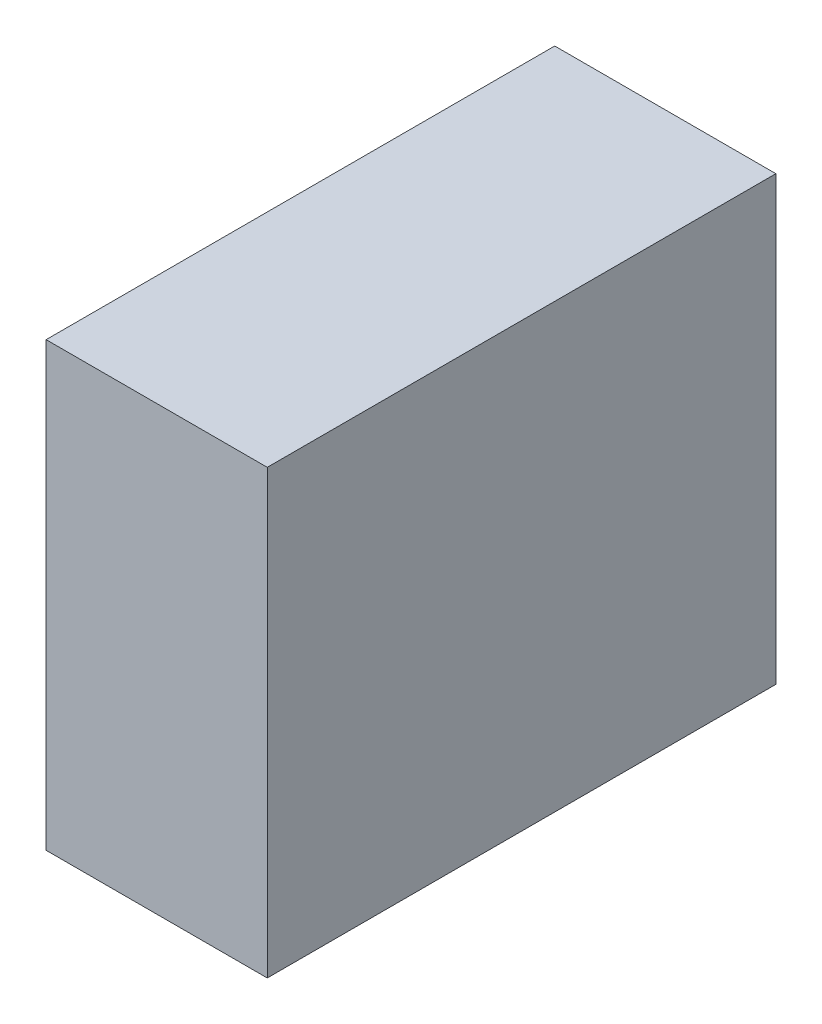
ISO-10303-21;
HEADER;
FILE_DESCRIPTION(('STEP AP214'),'2;1');
FILE_NAME('part.step','',(''),(''),'','','');
FILE_SCHEMA(('AUTOMOTIVE_DESIGN { 1 0 10303 214 1 1 1 1 }'));
ENDSEC;
DATA;
#1=APPLICATION_CONTEXT('core data for automotive mechanical design processes');
#2=APPLICATION_PROTOCOL_DEFINITION('international standard','automotive_design',2000,#1);
#3=PRODUCT_CONTEXT('',#1,'mechanical');
#4=PRODUCT('Part','Part','',(#3));
#5=PRODUCT_RELATED_PRODUCT_CATEGORY('part','',(#4));
#6=PRODUCT_DEFINITION_FORMATION('','',#4);
#7=PRODUCT_DEFINITION_CONTEXT('part definition',#1,'design');
#8=PRODUCT_DEFINITION('design','',#6,#7);
#9=PRODUCT_DEFINITION_SHAPE('','',#8);
#10=(LENGTH_UNIT() NAMED_UNIT(*) SI_UNIT(.MILLI.,.METRE.));
#11=(NAMED_UNIT(*) PLANE_ANGLE_UNIT() SI_UNIT($,.RADIAN.));
#12=(NAMED_UNIT(*) SI_UNIT($,.STERADIAN.) SOLID_ANGLE_UNIT());
#13=UNCERTAINTY_MEASURE_WITH_UNIT(LENGTH_MEASURE(1.E-05),#10,'distance_accuracy_value','');
#14=(GEOMETRIC_REPRESENTATION_CONTEXT(3) GLOBAL_UNCERTAINTY_ASSIGNED_CONTEXT((#13)) GLOBAL_UNIT_ASSIGNED_CONTEXT((#10,
#11,#12)) REPRESENTATION_CONTEXT('',''));
#15=CARTESIAN_POINT('',(0.,0.,0.));
#16=DIRECTION('',(0.,0.,1.));
#17=DIRECTION('',(1.,0.,0.));
#18=AXIS2_PLACEMENT_3D('',#15,#16,#17);
#19=CARTESIAN_POINT('',(10.,0.,0.));
#20=DIRECTION('',(0.,0.,-1.));
#21=DIRECTION('',(-1.,0.,0.));
#22=AXIS2_PLACEMENT_3D('',#19,#20,#21);
#23=PLANE('',#22);
#24=DIRECTION('',(0.,-1.,0.));
#25=VECTOR('',#24,1.);
#26=CARTESIAN_POINT('',(0.,0.,0.));
#27=LINE('',#26,#25);
#28=CARTESIAN_POINT('',(0.,20.,0.));
#29=VERTEX_POINT('',#28);
#30=CARTESIAN_POINT('',(0.,0.,0.));
#31=VERTEX_POINT('',#30);
#32=EDGE_CURVE('E105',#29,#31,#27,.T.);
#33=ORIENTED_EDGE('',*,*,#32,.T.);
#34=DIRECTION('',(-1.,0.,0.));
#35=VECTOR('',#34,1.);
#36=CARTESIAN_POINT('',(10.,0.,0.));
#37=LINE('',#36,#35);
#38=CARTESIAN_POINT('',(10.,0.,0.));
#39=VERTEX_POINT('',#38);
#40=EDGE_CURVE('E11',#39,#31,#37,.T.);
#41=ORIENTED_EDGE('',*,*,#40,.F.);
#42=DIRECTION('',(0.,-1.,0.));
#43=VECTOR('',#42,1.);
#44=CARTESIAN_POINT('',(10.,0.,0.));
#45=LINE('',#44,#43);
#46=CARTESIAN_POINT('',(10.,20.,0.));
#47=VERTEX_POINT('',#46);
#48=EDGE_CURVE('E89',#47,#39,#45,.T.);
#49=ORIENTED_EDGE('',*,*,#48,.F.);
#50=DIRECTION('',(-1.,0.,0.));
#51=VECTOR('',#50,1.);
#52=CARTESIAN_POINT('',(10.,20.,0.));
#53=LINE('',#52,#51);
#54=EDGE_CURVE('E97',#47,#29,#53,.T.);
#55=ORIENTED_EDGE('',*,*,#54,.T.);
#56=EDGE_LOOP('',(#33,#41,#49,#55));
#57=FACE_BOUND('',#56,.T.);
#58=ADVANCED_FACE('F39',(#57),#23,.F.);
#59=CARTESIAN_POINT('',(10.,0.,0.));
#60=DIRECTION('',(0.,1.,0.));
#61=DIRECTION('',(0.,0.,1.));
#62=AXIS2_PLACEMENT_3D('',#59,#60,#61);
#63=PLANE('',#62);
#64=DIRECTION('',(0.,0.,-1.));
#65=VECTOR('',#64,1.);
#66=CARTESIAN_POINT('',(0.,0.,0.));
#67=LINE('',#66,#65);
#68=CARTESIAN_POINT('',(0.,0.,-23.));
#69=VERTEX_POINT('',#68);
#70=EDGE_CURVE('E92',#31,#69,#67,.T.);
#71=ORIENTED_EDGE('',*,*,#70,.T.);
#72=DIRECTION('',(-1.,0.,0.));
#73=VECTOR('',#72,1.);
#74=CARTESIAN_POINT('',(10.,0.,-23.));
#75=LINE('',#74,#73);
#76=CARTESIAN_POINT('',(10.,0.,-23.));
#77=VERTEX_POINT('',#76);
#78=EDGE_CURVE('E50',#77,#69,#75,.T.);
#79=ORIENTED_EDGE('',*,*,#78,.F.);
#80=DIRECTION('',(0.,0.,-1.));
#81=VECTOR('',#80,1.);
#82=CARTESIAN_POINT('',(10.,0.,0.));
#83=LINE('',#82,#81);
#84=EDGE_CURVE('E82',#39,#77,#83,.T.);
#85=ORIENTED_EDGE('',*,*,#84,.F.);
#86=ORIENTED_EDGE('',*,*,#40,.T.);
#87=EDGE_LOOP('',(#71,#79,#85,#86));
#88=FACE_BOUND('',#87,.T.);
#89=ADVANCED_FACE('F93',(#88),#63,.F.);
#90=CARTESIAN_POINT('',(10.,0.,-23.));
#91=DIRECTION('',(0.,0.,1.));
#92=DIRECTION('',(1.,0.,0.));
#93=AXIS2_PLACEMENT_3D('',#90,#91,#92);
#94=PLANE('',#93);
#95=DIRECTION('',(0.,1.,0.));
#96=VECTOR('',#95,1.);
#97=CARTESIAN_POINT('',(0.,0.,-23.));
#98=LINE('',#97,#96);
#99=CARTESIAN_POINT('',(0.,20.,-23.));
#100=VERTEX_POINT('',#99);
#101=EDGE_CURVE('E72',#69,#100,#98,.T.);
#102=ORIENTED_EDGE('',*,*,#101,.T.);
#103=DIRECTION('',(-1.,0.,0.));
#104=VECTOR('',#103,1.);
#105=CARTESIAN_POINT('',(10.,20.,-23.));
#106=LINE('',#105,#104);
#107=CARTESIAN_POINT('',(10.,20.,-23.));
#108=VERTEX_POINT('',#107);
#109=EDGE_CURVE('E94',#108,#100,#106,.T.);
#110=ORIENTED_EDGE('',*,*,#109,.F.);
#111=DIRECTION('',(0.,1.,0.));
#112=VECTOR('',#111,1.);
#113=CARTESIAN_POINT('',(10.,0.,-23.));
#114=LINE('',#113,#112);
#115=EDGE_CURVE('E88',#77,#108,#114,.T.);
#116=ORIENTED_EDGE('',*,*,#115,.F.);
#117=ORIENTED_EDGE('',*,*,#78,.T.);
#118=EDGE_LOOP('',(#102,#110,#116,#117));
#119=FACE_BOUND('',#118,.T.);
#120=ADVANCED_FACE('F96',(#119),#94,.F.);
#121=CARTESIAN_POINT('',(10.,20.,0.));
#122=DIRECTION('',(0.,-1.,0.));
#123=DIRECTION('',(0.,0.,-1.));
#124=AXIS2_PLACEMENT_3D('',#121,#122,#123);
#125=PLANE('',#124);
#126=DIRECTION('',(0.,0.,1.));
#127=VECTOR('',#126,1.);
#128=CARTESIAN_POINT('',(0.,20.,0.));
#129=LINE('',#128,#127);
#130=EDGE_CURVE('E76',#100,#29,#129,.T.);
#131=ORIENTED_EDGE('',*,*,#130,.T.);
#132=ORIENTED_EDGE('',*,*,#54,.F.);
#133=DIRECTION('',(0.,0.,1.));
#134=VECTOR('',#133,1.);
#135=CARTESIAN_POINT('',(10.,20.,0.));
#136=LINE('',#135,#134);
#137=EDGE_CURVE('E54',#108,#47,#136,.T.);
#138=ORIENTED_EDGE('',*,*,#137,.F.);
#139=ORIENTED_EDGE('',*,*,#109,.T.);
#140=EDGE_LOOP('',(#131,#132,#138,#139));
#141=FACE_BOUND('',#140,.T.);
#142=ADVANCED_FACE('F108',(#141),#125,.F.);
#143=CARTESIAN_POINT('',(10.,0.,0.));
#144=DIRECTION('',(-1.,0.,0.));
#145=DIRECTION('',(0.,0.,1.));
#146=AXIS2_PLACEMENT_3D('',#143,#144,#145);
#147=PLANE('',#146);
#148=ORIENTED_EDGE('',*,*,#48,.T.);
#149=ORIENTED_EDGE('',*,*,#84,.T.);
#150=ORIENTED_EDGE('',*,*,#115,.T.);
#151=ORIENTED_EDGE('',*,*,#137,.T.);
#152=EDGE_LOOP('',(#148,#149,#150,#151));
#153=FACE_BOUND('',#152,.T.);
#154=ADVANCED_FACE('F86',(#153),#147,.F.);
#155=CARTESIAN_POINT('',(0.,0.,0.));
#156=DIRECTION('',(-1.,0.,0.));
#157=DIRECTION('',(0.,0.,1.));
#158=AXIS2_PLACEMENT_3D('',#155,#156,#157);
#159=PLANE('',#158);
#160=ORIENTED_EDGE('',*,*,#32,.F.);
#161=ORIENTED_EDGE('',*,*,#130,.F.);
#162=ORIENTED_EDGE('',*,*,#101,.F.);
#163=ORIENTED_EDGE('',*,*,#70,.F.);
#164=EDGE_LOOP('',(#160,#161,#162,#163));
#165=FACE_BOUND('',#164,.T.);
#166=ADVANCED_FACE('F115',(#165),#159,.T.);
#167=CLOSED_SHELL('',(#58,#89,#120,#142,#154,#166));
#168=MANIFOLD_SOLID_BREP('B2',#167);
#169=ADVANCED_BREP_SHAPE_REPRESENTATION('',(#18,#168),#14);
#170=SHAPE_DEFINITION_REPRESENTATION(#9,#169);
ENDSEC;
END-ISO-10303-21;
